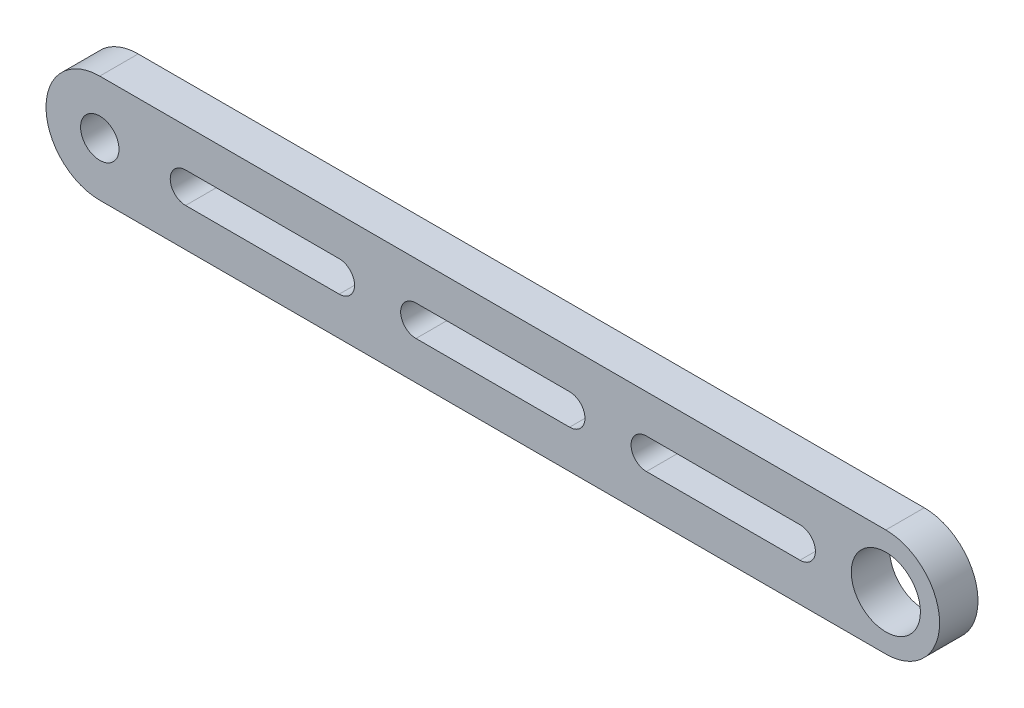
ISO-10303-21;
HEADER;
FILE_DESCRIPTION(('STEP AP214'),'2;1');
FILE_NAME('part.step','',(''),(''),'','','');
FILE_SCHEMA(('AUTOMOTIVE_DESIGN { 1 0 10303 214 1 1 1 1 }'));
ENDSEC;
DATA;
#1=APPLICATION_CONTEXT('core data for automotive mechanical design processes');
#2=APPLICATION_PROTOCOL_DEFINITION('international standard','automotive_design',2000,#1);
#3=PRODUCT_CONTEXT('',#1,'mechanical');
#4=PRODUCT('Part','Part','',(#3));
#5=PRODUCT_RELATED_PRODUCT_CATEGORY('part','',(#4));
#6=PRODUCT_DEFINITION_FORMATION('','',#4);
#7=PRODUCT_DEFINITION_CONTEXT('part definition',#1,'design');
#8=PRODUCT_DEFINITION('design','',#6,#7);
#9=PRODUCT_DEFINITION_SHAPE('','',#8);
#10=(LENGTH_UNIT() NAMED_UNIT(*) SI_UNIT(.MILLI.,.METRE.));
#11=(NAMED_UNIT(*) PLANE_ANGLE_UNIT() SI_UNIT($,.RADIAN.));
#12=(NAMED_UNIT(*) SI_UNIT($,.STERADIAN.) SOLID_ANGLE_UNIT());
#13=UNCERTAINTY_MEASURE_WITH_UNIT(LENGTH_MEASURE(1.E-05),#10,'distance_accuracy_value','');
#14=(GEOMETRIC_REPRESENTATION_CONTEXT(3) GLOBAL_UNCERTAINTY_ASSIGNED_CONTEXT((#13)) GLOBAL_UNIT_ASSIGNED_CONTEXT((#10,
#11,#12)) REPRESENTATION_CONTEXT('',''));
#15=CARTESIAN_POINT('',(0.,0.,0.));
#16=DIRECTION('',(0.,0.,1.));
#17=DIRECTION('',(1.,0.,0.));
#18=AXIS2_PLACEMENT_3D('',#15,#16,#17);
#19=CARTESIAN_POINT('',(-51.175,0.,2.5));
#20=DIRECTION('',(0.,0.,1.));
#21=DIRECTION('',(1.,0.,0.));
#22=AXIS2_PLACEMENT_3D('',#19,#20,#21);
#23=PLANE('',#22);
#24=CARTESIAN_POINT('',(-40.,0.,2.5));
#25=DIRECTION('',(0.,0.,1.));
#26=DIRECTION('',(1.,0.,0.));
#27=AXIS2_PLACEMENT_3D('',#24,#25,#26);
#28=CIRCLE('',#27,2.);
#29=CARTESIAN_POINT('',(-40.,2.,2.5));
#30=VERTEX_POINT('',#29);
#31=CARTESIAN_POINT('',(-40.,-2.00000000000001,2.5));
#32=VERTEX_POINT('',#31);
#33=EDGE_CURVE('E51',#30,#32,#28,.T.);
#34=ORIENTED_EDGE('',*,*,#33,.F.);
#35=DIRECTION('',(-1.,0.,0.));
#36=VECTOR('',#35,1.);
#37=CARTESIAN_POINT('',(-40.,2.,2.5));
#38=LINE('',#37,#36);
#39=CARTESIAN_POINT('',(-20.,2.,2.5));
#40=VERTEX_POINT('',#39);
#41=EDGE_CURVE('E173',#40,#30,#38,.T.);
#42=ORIENTED_EDGE('',*,*,#41,.F.);
#43=CARTESIAN_POINT('',(-20.,0.,2.5));
#44=DIRECTION('',(0.,0.,1.));
#45=DIRECTION('',(1.,0.,0.));
#46=AXIS2_PLACEMENT_3D('',#43,#44,#45);
#47=CIRCLE('',#46,2.);
#48=CARTESIAN_POINT('',(-20.,-2.00000000000001,2.5));
#49=VERTEX_POINT('',#48);
#50=EDGE_CURVE('E166',#49,#40,#47,.T.);
#51=ORIENTED_EDGE('',*,*,#50,.F.);
#52=DIRECTION('',(1.,0.,0.));
#53=VECTOR('',#52,1.);
#54=CARTESIAN_POINT('',(-40.,-2.00000000000001,2.5));
#55=LINE('',#54,#53);
#56=EDGE_CURVE('E153',#32,#49,#55,.T.);
#57=ORIENTED_EDGE('',*,*,#56,.F.);
#58=EDGE_LOOP('',(#34,#42,#51,#57));
#59=FACE_BOUND('',#58,.T.);
#60=CARTESIAN_POINT('',(20.,0.,2.5));
#61=DIRECTION('',(0.,0.,1.));
#62=DIRECTION('',(1.,0.,0.));
#63=AXIS2_PLACEMENT_3D('',#60,#61,#62);
#64=CIRCLE('',#63,2.);
#65=CARTESIAN_POINT('',(20.,2.,2.5));
#66=VERTEX_POINT('',#65);
#67=CARTESIAN_POINT('',(20.,-2.,2.5));
#68=VERTEX_POINT('',#67);
#69=EDGE_CURVE('E59',#66,#68,#64,.T.);
#70=ORIENTED_EDGE('',*,*,#69,.F.);
#71=DIRECTION('',(-1.,0.,0.));
#72=VECTOR('',#71,1.);
#73=CARTESIAN_POINT('',(20.,2.,2.5));
#74=LINE('',#73,#72);
#75=CARTESIAN_POINT('',(40.,2.00000000000001,2.5));
#76=VERTEX_POINT('',#75);
#77=EDGE_CURVE('E210',#76,#66,#74,.T.);
#78=ORIENTED_EDGE('',*,*,#77,.F.);
#79=CARTESIAN_POINT('',(40.,0.,2.5));
#80=DIRECTION('',(0.,0.,1.));
#81=DIRECTION('',(1.,0.,0.));
#82=AXIS2_PLACEMENT_3D('',#79,#80,#81);
#83=CIRCLE('',#82,2.);
#84=CARTESIAN_POINT('',(40.,-2.,2.5));
#85=VERTEX_POINT('',#84);
#86=EDGE_CURVE('E202',#85,#76,#83,.T.);
#87=ORIENTED_EDGE('',*,*,#86,.F.);
#88=DIRECTION('',(1.,0.,0.));
#89=VECTOR('',#88,1.);
#90=CARTESIAN_POINT('',(20.,-2.,2.5));
#91=LINE('',#90,#89);
#92=EDGE_CURVE('E191',#68,#85,#91,.T.);
#93=ORIENTED_EDGE('',*,*,#92,.F.);
#94=EDGE_LOOP('',(#70,#78,#87,#93));
#95=FACE_BOUND('',#94,.T.);
#96=CARTESIAN_POINT('',(-10.,0.,2.5));
#97=DIRECTION('',(0.,0.,1.));
#98=DIRECTION('',(1.,0.,0.));
#99=AXIS2_PLACEMENT_3D('',#96,#97,#98);
#100=CIRCLE('',#99,2.);
#101=CARTESIAN_POINT('',(-10.,2.,2.5));
#102=VERTEX_POINT('',#101);
#103=CARTESIAN_POINT('',(-9.99999999999999,-2.,2.5));
#104=VERTEX_POINT('',#103);
#105=EDGE_CURVE('E190',#102,#104,#100,.T.);
#106=ORIENTED_EDGE('',*,*,#105,.F.);
#107=DIRECTION('',(-1.,0.,0.));
#108=VECTOR('',#107,1.);
#109=CARTESIAN_POINT('',(-10.,2.,2.5));
#110=LINE('',#109,#108);
#111=CARTESIAN_POINT('',(10.,2.00000000000001,2.5));
#112=VERTEX_POINT('',#111);
#113=EDGE_CURVE('E227',#112,#102,#110,.T.);
#114=ORIENTED_EDGE('',*,*,#113,.F.);
#115=CARTESIAN_POINT('',(10.,0.,2.5));
#116=DIRECTION('',(0.,0.,1.));
#117=DIRECTION('',(1.,0.,0.));
#118=AXIS2_PLACEMENT_3D('',#115,#116,#117);
#119=CIRCLE('',#118,2.);
#120=CARTESIAN_POINT('',(10.,-2.,2.5));
#121=VERTEX_POINT('',#120);
#122=EDGE_CURVE('E224',#121,#112,#119,.T.);
#123=ORIENTED_EDGE('',*,*,#122,.F.);
#124=DIRECTION('',(1.,0.,0.));
#125=VECTOR('',#124,1.);
#126=CARTESIAN_POINT('',(-10.,-2.,2.5));
#127=LINE('',#126,#125);
#128=EDGE_CURVE('E221',#104,#121,#127,.T.);
#129=ORIENTED_EDGE('',*,*,#128,.F.);
#130=EDGE_LOOP('',(#106,#114,#123,#129));
#131=FACE_BOUND('',#130,.T.);
#132=CARTESIAN_POINT('',(51.175,0.,2.5));
#133=DIRECTION('',(0.,0.,1.));
#134=DIRECTION('',(1.,0.,0.));
#135=AXIS2_PLACEMENT_3D('',#132,#133,#134);
#136=CIRCLE('',#135,4.5);
#137=CARTESIAN_POINT('',(55.675,0.,2.5));
#138=VERTEX_POINT('',#137);
#139=EDGE_CURVE('E240',#138,#138,#136,.T.);
#140=ORIENTED_EDGE('',*,*,#139,.F.);
#141=EDGE_LOOP('',(#140));
#142=FACE_BOUND('',#141,.T.);
#143=CARTESIAN_POINT('',(-51.175,0.,2.5));
#144=DIRECTION('',(0.,0.,1.));
#145=DIRECTION('',(1.,0.,0.));
#146=AXIS2_PLACEMENT_3D('',#143,#144,#145);
#147=CIRCLE('',#146,7.00000000000002);
#148=CARTESIAN_POINT('',(-51.175,7.00000000000002,2.5));
#149=VERTEX_POINT('',#148);
#150=CARTESIAN_POINT('',(-51.175,-7.00000000000002,2.5));
#151=VERTEX_POINT('',#150);
#152=EDGE_CURVE('E246',#149,#151,#147,.T.);
#153=ORIENTED_EDGE('',*,*,#152,.T.);
#154=DIRECTION('',(1.,0.,0.));
#155=VECTOR('',#154,1.);
#156=CARTESIAN_POINT('',(-51.175,-7.00000000000002,2.5));
#157=LINE('',#156,#155);
#158=CARTESIAN_POINT('',(51.175,-7.00000000000002,2.5));
#159=VERTEX_POINT('',#158);
#160=EDGE_CURVE('E249',#151,#159,#157,.T.);
#161=ORIENTED_EDGE('',*,*,#160,.T.);
#162=CARTESIAN_POINT('',(51.175,0.,2.5));
#163=DIRECTION('',(0.,0.,1.));
#164=DIRECTION('',(1.,0.,0.));
#165=AXIS2_PLACEMENT_3D('',#162,#163,#164);
#166=CIRCLE('',#165,7.00000000000002);
#167=CARTESIAN_POINT('',(51.175,7.00000000000004,2.5));
#168=VERTEX_POINT('',#167);
#169=EDGE_CURVE('E252',#159,#168,#166,.T.);
#170=ORIENTED_EDGE('',*,*,#169,.T.);
#171=DIRECTION('',(-1.,0.,0.));
#172=VECTOR('',#171,1.);
#173=CARTESIAN_POINT('',(-51.175,7.00000000000002,2.5));
#174=LINE('',#173,#172);
#175=EDGE_CURVE('E254',#168,#149,#174,.T.);
#176=ORIENTED_EDGE('',*,*,#175,.T.);
#177=EDGE_LOOP('',(#153,#161,#170,#176));
#178=FACE_BOUND('',#177,.T.);
#179=CARTESIAN_POINT('',(-51.175,0.,2.5));
#180=DIRECTION('',(0.,0.,1.));
#181=DIRECTION('',(1.,0.,0.));
#182=AXIS2_PLACEMENT_3D('',#179,#180,#181);
#183=CIRCLE('',#182,2.5);
#184=CARTESIAN_POINT('',(-48.675,0.,2.5));
#185=VERTEX_POINT('',#184);
#186=EDGE_CURVE('E352',#185,#185,#183,.T.);
#187=ORIENTED_EDGE('',*,*,#186,.F.);
#188=EDGE_LOOP('',(#187));
#189=FACE_BOUND('',#188,.T.);
#190=ADVANCED_FACE('F36',(#59,#95,#131,#142,#178,#189),#23,.T.);
#191=CARTESIAN_POINT('',(-51.175,0.,-2.5));
#192=DIRECTION('',(0.,0.,1.));
#193=DIRECTION('',(1.,0.,0.));
#194=AXIS2_PLACEMENT_3D('',#191,#192,#193);
#195=PLANE('',#194);
#196=DIRECTION('',(-1.,0.,0.));
#197=VECTOR('',#196,1.);
#198=CARTESIAN_POINT('',(-81.175,1.99999999999999,-2.5));
#199=LINE('',#198,#197);
#200=CARTESIAN_POINT('',(-20.,2.,-2.5));
#201=VERTEX_POINT('',#200);
#202=CARTESIAN_POINT('',(-40.,2.,-2.5));
#203=VERTEX_POINT('',#202);
#204=EDGE_CURVE('E183',#201,#203,#199,.T.);
#205=ORIENTED_EDGE('',*,*,#204,.T.);
#206=CARTESIAN_POINT('',(-40.,0.,-2.5));
#207=DIRECTION('',(0.,0.,1.));
#208=DIRECTION('',(1.,0.,0.));
#209=AXIS2_PLACEMENT_3D('',#206,#207,#208);
#210=CIRCLE('',#209,2.);
#211=CARTESIAN_POINT('',(-40.,-2.00000000000001,-2.5));
#212=VERTEX_POINT('',#211);
#213=EDGE_CURVE('E187',#203,#212,#210,.T.);
#214=ORIENTED_EDGE('',*,*,#213,.T.);
#215=DIRECTION('',(1.,0.,0.));
#216=VECTOR('',#215,1.);
#217=CARTESIAN_POINT('',(-81.175,-2.00000000000002,-2.5));
#218=LINE('',#217,#216);
#219=CARTESIAN_POINT('',(-20.,-2.00000000000001,-2.5));
#220=VERTEX_POINT('',#219);
#221=EDGE_CURVE('E161',#212,#220,#218,.T.);
#222=ORIENTED_EDGE('',*,*,#221,.T.);
#223=CARTESIAN_POINT('',(-20.,0.,-2.5));
#224=DIRECTION('',(0.,0.,1.));
#225=DIRECTION('',(1.,0.,0.));
#226=AXIS2_PLACEMENT_3D('',#223,#224,#225);
#227=CIRCLE('',#226,2.);
#228=EDGE_CURVE('E169',#220,#201,#227,.T.);
#229=ORIENTED_EDGE('',*,*,#228,.T.);
#230=EDGE_LOOP('',(#205,#214,#222,#229));
#231=FACE_BOUND('',#230,.T.);
#232=DIRECTION('',(-1.,0.,0.));
#233=VECTOR('',#232,1.);
#234=CARTESIAN_POINT('',(-21.175,2.,-2.5));
#235=LINE('',#234,#233);
#236=CARTESIAN_POINT('',(40.,2.00000000000001,-2.5));
#237=VERTEX_POINT('',#236);
#238=CARTESIAN_POINT('',(20.,2.,-2.5));
#239=VERTEX_POINT('',#238);
#240=EDGE_CURVE('E214',#237,#239,#235,.T.);
#241=ORIENTED_EDGE('',*,*,#240,.T.);
#242=CARTESIAN_POINT('',(20.,0.,-2.5));
#243=DIRECTION('',(0.,0.,1.));
#244=DIRECTION('',(1.,0.,0.));
#245=AXIS2_PLACEMENT_3D('',#242,#243,#244);
#246=CIRCLE('',#245,2.);
#247=CARTESIAN_POINT('',(20.,-2.,-2.5));
#248=VERTEX_POINT('',#247);
#249=EDGE_CURVE('E162',#239,#248,#246,.T.);
#250=ORIENTED_EDGE('',*,*,#249,.T.);
#251=DIRECTION('',(1.,0.,0.));
#252=VECTOR('',#251,1.);
#253=CARTESIAN_POINT('',(-21.175,-2.00000000000001,-2.5));
#254=LINE('',#253,#252);
#255=CARTESIAN_POINT('',(40.,-2.,-2.5));
#256=VERTEX_POINT('',#255);
#257=EDGE_CURVE('E193',#248,#256,#254,.T.);
#258=ORIENTED_EDGE('',*,*,#257,.T.);
#259=CARTESIAN_POINT('',(40.,0.,-2.5));
#260=DIRECTION('',(0.,0.,1.));
#261=DIRECTION('',(1.,0.,0.));
#262=AXIS2_PLACEMENT_3D('',#259,#260,#261);
#263=CIRCLE('',#262,2.);
#264=EDGE_CURVE('E207',#256,#237,#263,.T.);
#265=ORIENTED_EDGE('',*,*,#264,.T.);
#266=EDGE_LOOP('',(#241,#250,#258,#265));
#267=FACE_BOUND('',#266,.T.);
#268=DIRECTION('',(-1.,0.,0.));
#269=VECTOR('',#268,1.);
#270=CARTESIAN_POINT('',(-51.175,2.,-2.5));
#271=LINE('',#270,#269);
#272=CARTESIAN_POINT('',(10.,2.00000000000001,-2.5));
#273=VERTEX_POINT('',#272);
#274=CARTESIAN_POINT('',(-10.,2.,-2.5));
#275=VERTEX_POINT('',#274);
#276=EDGE_CURVE('E44',#273,#275,#271,.T.);
#277=ORIENTED_EDGE('',*,*,#276,.T.);
#278=CARTESIAN_POINT('',(-10.,0.,-2.5));
#279=DIRECTION('',(0.,0.,1.));
#280=DIRECTION('',(1.,0.,0.));
#281=AXIS2_PLACEMENT_3D('',#278,#279,#280);
#282=CIRCLE('',#281,2.);
#283=CARTESIAN_POINT('',(-10.,-2.,-2.5));
#284=VERTEX_POINT('',#283);
#285=EDGE_CURVE('E11',#275,#284,#282,.T.);
#286=ORIENTED_EDGE('',*,*,#285,.T.);
#287=DIRECTION('',(1.,0.,0.));
#288=VECTOR('',#287,1.);
#289=CARTESIAN_POINT('',(-51.175,-2.00000000000001,-2.5));
#290=LINE('',#289,#288);
#291=CARTESIAN_POINT('',(9.99999999999999,-2.,-2.5));
#292=VERTEX_POINT('',#291);
#293=EDGE_CURVE('E275',#284,#292,#290,.T.);
#294=ORIENTED_EDGE('',*,*,#293,.T.);
#295=CARTESIAN_POINT('',(10.,0.,-2.5));
#296=DIRECTION('',(0.,0.,1.));
#297=DIRECTION('',(1.,0.,0.));
#298=AXIS2_PLACEMENT_3D('',#295,#296,#297);
#299=CIRCLE('',#298,2.);
#300=EDGE_CURVE('E278',#292,#273,#299,.T.);
#301=ORIENTED_EDGE('',*,*,#300,.T.);
#302=EDGE_LOOP('',(#277,#286,#294,#301));
#303=FACE_BOUND('',#302,.T.);
#304=CARTESIAN_POINT('',(-51.175,0.,-2.5));
#305=DIRECTION('',(0.,0.,1.));
#306=DIRECTION('',(1.,0.,0.));
#307=AXIS2_PLACEMENT_3D('',#304,#305,#306);
#308=CIRCLE('',#307,7.00000000000002);
#309=CARTESIAN_POINT('',(-51.175,7.00000000000002,-2.5));
#310=VERTEX_POINT('',#309);
#311=CARTESIAN_POINT('',(-51.175,-7.00000000000002,-2.5));
#312=VERTEX_POINT('',#311);
#313=EDGE_CURVE('E243',#310,#312,#308,.T.);
#314=ORIENTED_EDGE('',*,*,#313,.F.);
#315=DIRECTION('',(-1.,0.,0.));
#316=VECTOR('',#315,1.);
#317=CARTESIAN_POINT('',(-51.175,7.00000000000002,-2.5));
#318=LINE('',#317,#316);
#319=CARTESIAN_POINT('',(51.175,7.00000000000004,-2.5));
#320=VERTEX_POINT('',#319);
#321=EDGE_CURVE('E250',#320,#310,#318,.T.);
#322=ORIENTED_EDGE('',*,*,#321,.F.);
#323=CARTESIAN_POINT('',(51.175,0.,-2.5));
#324=DIRECTION('',(0.,0.,1.));
#325=DIRECTION('',(1.,0.,0.));
#326=AXIS2_PLACEMENT_3D('',#323,#324,#325);
#327=CIRCLE('',#326,7.00000000000002);
#328=CARTESIAN_POINT('',(51.175,-7.00000000000002,-2.5));
#329=VERTEX_POINT('',#328);
#330=EDGE_CURVE('E261',#329,#320,#327,.T.);
#331=ORIENTED_EDGE('',*,*,#330,.F.);
#332=DIRECTION('',(1.,0.,0.));
#333=VECTOR('',#332,1.);
#334=CARTESIAN_POINT('',(-51.175,-7.00000000000002,-2.5));
#335=LINE('',#334,#333);
#336=EDGE_CURVE('E259',#312,#329,#335,.T.);
#337=ORIENTED_EDGE('',*,*,#336,.F.);
#338=EDGE_LOOP('',(#314,#322,#331,#337));
#339=FACE_BOUND('',#338,.T.);
#340=CARTESIAN_POINT('',(51.175,0.,-2.5));
#341=DIRECTION('',(0.,0.,1.));
#342=DIRECTION('',(1.,0.,0.));
#343=AXIS2_PLACEMENT_3D('',#340,#341,#342);
#344=CIRCLE('',#343,4.5);
#345=CARTESIAN_POINT('',(55.675,0.,-2.5));
#346=VERTEX_POINT('',#345);
#347=EDGE_CURVE('E233',#346,#346,#344,.T.);
#348=ORIENTED_EDGE('',*,*,#347,.T.);
#349=EDGE_LOOP('',(#348));
#350=FACE_BOUND('',#349,.T.);
#351=CARTESIAN_POINT('',(-51.175,0.,-2.5));
#352=DIRECTION('',(0.,0.,1.));
#353=DIRECTION('',(1.,0.,0.));
#354=AXIS2_PLACEMENT_3D('',#351,#352,#353);
#355=CIRCLE('',#354,2.5);
#356=CARTESIAN_POINT('',(-48.675,0.,-2.5));
#357=VERTEX_POINT('',#356);
#358=EDGE_CURVE('E194',#357,#357,#355,.F.);
#359=ORIENTED_EDGE('',*,*,#358,.F.);
#360=EDGE_LOOP('',(#359));
#361=FACE_BOUND('',#360,.T.);
#362=ADVANCED_FACE('F282',(#231,#267,#303,#339,#350,#361),#195,.F.);
#363=CARTESIAN_POINT('',(-51.175,0.,2.5));
#364=DIRECTION('',(0.,0.,-1.));
#365=DIRECTION('',(-1.,0.,0.));
#366=AXIS2_PLACEMENT_3D('',#363,#364,#365);
#367=CYLINDRICAL_SURFACE('',#366,7.00000000000002);
#368=ORIENTED_EDGE('',*,*,#313,.T.);
#369=DIRECTION('',(0.,0.,-1.));
#370=VECTOR('',#369,1.);
#371=CARTESIAN_POINT('',(-51.175,-7.00000000000002,2.5));
#372=LINE('',#371,#370);
#373=EDGE_CURVE('E272',#151,#312,#372,.T.);
#374=ORIENTED_EDGE('',*,*,#373,.F.);
#375=ORIENTED_EDGE('',*,*,#152,.F.);
#376=DIRECTION('',(0.,0.,-1.));
#377=VECTOR('',#376,1.);
#378=CARTESIAN_POINT('',(-51.175,7.00000000000002,2.5));
#379=LINE('',#378,#377);
#380=EDGE_CURVE('E256',#149,#310,#379,.T.);
#381=ORIENTED_EDGE('',*,*,#380,.T.);
#382=EDGE_LOOP('',(#368,#374,#375,#381));
#383=FACE_BOUND('',#382,.T.);
#384=ADVANCED_FACE('F38',(#383),#367,.T.);
#385=CARTESIAN_POINT('',(-51.175,-7.00000000000002,2.5));
#386=DIRECTION('',(0.,1.,0.));
#387=DIRECTION('',(-1.,0.,0.));
#388=AXIS2_PLACEMENT_3D('',#385,#386,#387);
#389=PLANE('',#388);
#390=ORIENTED_EDGE('',*,*,#336,.T.);
#391=DIRECTION('',(0.,0.,-1.));
#392=VECTOR('',#391,1.);
#393=CARTESIAN_POINT('',(51.175,-7.00000000000002,2.5));
#394=LINE('',#393,#392);
#395=EDGE_CURVE('E269',#159,#329,#394,.T.);
#396=ORIENTED_EDGE('',*,*,#395,.F.);
#397=ORIENTED_EDGE('',*,*,#160,.F.);
#398=ORIENTED_EDGE('',*,*,#373,.T.);
#399=EDGE_LOOP('',(#390,#396,#397,#398));
#400=FACE_BOUND('',#399,.T.);
#401=ADVANCED_FACE('F329',(#400),#389,.F.);
#402=CARTESIAN_POINT('',(51.175,0.,2.5));
#403=DIRECTION('',(0.,0.,-1.));
#404=DIRECTION('',(-1.,0.,0.));
#405=AXIS2_PLACEMENT_3D('',#402,#403,#404);
#406=CYLINDRICAL_SURFACE('',#405,7.00000000000002);
#407=ORIENTED_EDGE('',*,*,#330,.T.);
#408=DIRECTION('',(0.,0.,-1.));
#409=VECTOR('',#408,1.);
#410=CARTESIAN_POINT('',(51.175,7.00000000000004,2.5));
#411=LINE('',#410,#409);
#412=EDGE_CURVE('E266',#168,#320,#411,.T.);
#413=ORIENTED_EDGE('',*,*,#412,.F.);
#414=ORIENTED_EDGE('',*,*,#169,.F.);
#415=ORIENTED_EDGE('',*,*,#395,.T.);
#416=EDGE_LOOP('',(#407,#413,#414,#415));
#417=FACE_BOUND('',#416,.T.);
#418=ADVANCED_FACE('F326',(#417),#406,.T.);
#419=CARTESIAN_POINT('',(-51.175,7.00000000000002,2.5));
#420=DIRECTION('',(0.,-1.,0.));
#421=DIRECTION('',(1.,0.,0.));
#422=AXIS2_PLACEMENT_3D('',#419,#420,#421);
#423=PLANE('',#422);
#424=ORIENTED_EDGE('',*,*,#321,.T.);
#425=ORIENTED_EDGE('',*,*,#380,.F.);
#426=ORIENTED_EDGE('',*,*,#175,.F.);
#427=ORIENTED_EDGE('',*,*,#412,.T.);
#428=EDGE_LOOP('',(#424,#425,#426,#427));
#429=FACE_BOUND('',#428,.T.);
#430=ADVANCED_FACE('F323',(#429),#423,.F.);
#431=CARTESIAN_POINT('',(51.175,0.,2.5));
#432=DIRECTION('',(0.,0.,-1.));
#433=DIRECTION('',(-1.,0.,0.));
#434=AXIS2_PLACEMENT_3D('',#431,#432,#433);
#435=CYLINDRICAL_SURFACE('',#434,4.5);
#436=ORIENTED_EDGE('',*,*,#139,.T.);
#437=EDGE_LOOP('',(#436));
#438=FACE_BOUND('',#437,.T.);
#439=ORIENTED_EDGE('',*,*,#347,.F.);
#440=EDGE_LOOP('',(#439));
#441=FACE_BOUND('',#440,.T.);
#442=ADVANCED_FACE('F321',(#438,#441),#435,.F.);
#443=CARTESIAN_POINT('',(-10.,0.,-7.5));
#444=DIRECTION('',(0.,0.,1.));
#445=DIRECTION('',(1.,0.,0.));
#446=AXIS2_PLACEMENT_3D('',#443,#444,#445);
#447=CYLINDRICAL_SURFACE('',#446,2.);
#448=DIRECTION('',(0.,0.,1.));
#449=VECTOR('',#448,1.);
#450=CARTESIAN_POINT('',(-10.,2.,-7.5));
#451=LINE('',#450,#449);
#452=EDGE_CURVE('E231',#275,#102,#451,.T.);
#453=ORIENTED_EDGE('',*,*,#452,.T.);
#454=ORIENTED_EDGE('',*,*,#105,.T.);
#455=DIRECTION('',(0.,0.,1.));
#456=VECTOR('',#455,1.);
#457=CARTESIAN_POINT('',(-10.,-2.,-7.5));
#458=LINE('',#457,#456);
#459=EDGE_CURVE('E230',#284,#104,#458,.T.);
#460=ORIENTED_EDGE('',*,*,#459,.F.);
#461=ORIENTED_EDGE('',*,*,#285,.F.);
#462=EDGE_LOOP('',(#453,#454,#460,#461));
#463=FACE_BOUND('',#462,.T.);
#464=ADVANCED_FACE('F299',(#463),#447,.F.);
#465=CARTESIAN_POINT('',(-10.,2.,-7.5));
#466=DIRECTION('',(0.,1.,0.));
#467=DIRECTION('',(-1.,0.,0.));
#468=AXIS2_PLACEMENT_3D('',#465,#466,#467);
#469=PLANE('',#468);
#470=DIRECTION('',(0.,0.,1.));
#471=VECTOR('',#470,1.);
#472=CARTESIAN_POINT('',(10.,2.00000000000001,-7.5));
#473=LINE('',#472,#471);
#474=EDGE_CURVE('E234',#273,#112,#473,.T.);
#475=ORIENTED_EDGE('',*,*,#474,.T.);
#476=ORIENTED_EDGE('',*,*,#113,.T.);
#477=ORIENTED_EDGE('',*,*,#452,.F.);
#478=ORIENTED_EDGE('',*,*,#276,.F.);
#479=EDGE_LOOP('',(#475,#476,#477,#478));
#480=FACE_BOUND('',#479,.T.);
#481=ADVANCED_FACE('F288',(#480),#469,.F.);
#482=CARTESIAN_POINT('',(10.,0.,-7.5));
#483=DIRECTION('',(0.,0.,1.));
#484=DIRECTION('',(1.,0.,0.));
#485=AXIS2_PLACEMENT_3D('',#482,#483,#484);
#486=CYLINDRICAL_SURFACE('',#485,2.);
#487=DIRECTION('',(0.,0.,1.));
#488=VECTOR('',#487,1.);
#489=CARTESIAN_POINT('',(10.,-2.,-7.5));
#490=LINE('',#489,#488);
#491=EDGE_CURVE('E236',#292,#121,#490,.T.);
#492=ORIENTED_EDGE('',*,*,#491,.T.);
#493=ORIENTED_EDGE('',*,*,#122,.T.);
#494=ORIENTED_EDGE('',*,*,#474,.F.);
#495=ORIENTED_EDGE('',*,*,#300,.F.);
#496=EDGE_LOOP('',(#492,#493,#494,#495));
#497=FACE_BOUND('',#496,.T.);
#498=ADVANCED_FACE('F290',(#497),#486,.F.);
#499=CARTESIAN_POINT('',(-10.,-2.,-7.5));
#500=DIRECTION('',(0.,-1.,0.));
#501=DIRECTION('',(1.,0.,0.));
#502=AXIS2_PLACEMENT_3D('',#499,#500,#501);
#503=PLANE('',#502);
#504=ORIENTED_EDGE('',*,*,#459,.T.);
#505=ORIENTED_EDGE('',*,*,#128,.T.);
#506=ORIENTED_EDGE('',*,*,#491,.F.);
#507=ORIENTED_EDGE('',*,*,#293,.F.);
#508=EDGE_LOOP('',(#504,#505,#506,#507));
#509=FACE_BOUND('',#508,.T.);
#510=ADVANCED_FACE('F301',(#509),#503,.F.);
#511=CARTESIAN_POINT('',(20.,0.,-7.5));
#512=DIRECTION('',(0.,0.,1.));
#513=DIRECTION('',(1.,0.,0.));
#514=AXIS2_PLACEMENT_3D('',#511,#512,#513);
#515=CYLINDRICAL_SURFACE('',#514,2.);
#516=DIRECTION('',(0.,0.,1.));
#517=VECTOR('',#516,1.);
#518=CARTESIAN_POINT('',(20.,2.,-7.5));
#519=LINE('',#518,#517);
#520=EDGE_CURVE('E212',#239,#66,#519,.T.);
#521=ORIENTED_EDGE('',*,*,#520,.T.);
#522=ORIENTED_EDGE('',*,*,#69,.T.);
#523=DIRECTION('',(0.,0.,1.));
#524=VECTOR('',#523,1.);
#525=CARTESIAN_POINT('',(20.,-2.,-7.5));
#526=LINE('',#525,#524);
#527=EDGE_CURVE('E197',#248,#68,#526,.T.);
#528=ORIENTED_EDGE('',*,*,#527,.F.);
#529=ORIENTED_EDGE('',*,*,#249,.F.);
#530=EDGE_LOOP('',(#521,#522,#528,#529));
#531=FACE_BOUND('',#530,.T.);
#532=ADVANCED_FACE('F303',(#531),#515,.F.);
#533=CARTESIAN_POINT('',(20.,2.,-7.5));
#534=DIRECTION('',(0.,1.,0.));
#535=DIRECTION('',(-1.,0.,0.));
#536=AXIS2_PLACEMENT_3D('',#533,#534,#535);
#537=PLANE('',#536);
#538=DIRECTION('',(0.,0.,1.));
#539=VECTOR('',#538,1.);
#540=CARTESIAN_POINT('',(40.,2.00000000000001,-7.5));
#541=LINE('',#540,#539);
#542=EDGE_CURVE('E204',#237,#76,#541,.T.);
#543=ORIENTED_EDGE('',*,*,#542,.T.);
#544=ORIENTED_EDGE('',*,*,#77,.T.);
#545=ORIENTED_EDGE('',*,*,#520,.F.);
#546=ORIENTED_EDGE('',*,*,#240,.F.);
#547=EDGE_LOOP('',(#543,#544,#545,#546));
#548=FACE_BOUND('',#547,.T.);
#549=ADVANCED_FACE('F309',(#548),#537,.F.);
#550=CARTESIAN_POINT('',(40.,0.,-7.5));
#551=DIRECTION('',(0.,0.,1.));
#552=DIRECTION('',(1.,0.,0.));
#553=AXIS2_PLACEMENT_3D('',#550,#551,#552);
#554=CYLINDRICAL_SURFACE('',#553,2.);
#555=DIRECTION('',(0.,0.,1.));
#556=VECTOR('',#555,1.);
#557=CARTESIAN_POINT('',(40.,-2.,-7.5));
#558=LINE('',#557,#556);
#559=EDGE_CURVE('E199',#256,#85,#558,.T.);
#560=ORIENTED_EDGE('',*,*,#559,.T.);
#561=ORIENTED_EDGE('',*,*,#86,.T.);
#562=ORIENTED_EDGE('',*,*,#542,.F.);
#563=ORIENTED_EDGE('',*,*,#264,.F.);
#564=EDGE_LOOP('',(#560,#561,#562,#563));
#565=FACE_BOUND('',#564,.T.);
#566=ADVANCED_FACE('F377',(#565),#554,.F.);
#567=CARTESIAN_POINT('',(20.,-2.,-7.5));
#568=DIRECTION('',(0.,-1.,0.));
#569=DIRECTION('',(1.,0.,0.));
#570=AXIS2_PLACEMENT_3D('',#567,#568,#569);
#571=PLANE('',#570);
#572=ORIENTED_EDGE('',*,*,#527,.T.);
#573=ORIENTED_EDGE('',*,*,#92,.T.);
#574=ORIENTED_EDGE('',*,*,#559,.F.);
#575=ORIENTED_EDGE('',*,*,#257,.F.);
#576=EDGE_LOOP('',(#572,#573,#574,#575));
#577=FACE_BOUND('',#576,.T.);
#578=ADVANCED_FACE('F371',(#577),#571,.F.);
#579=CARTESIAN_POINT('',(-40.,0.,-7.5));
#580=DIRECTION('',(0.,0.,1.));
#581=DIRECTION('',(1.,0.,0.));
#582=AXIS2_PLACEMENT_3D('',#579,#580,#581);
#583=CYLINDRICAL_SURFACE('',#582,2.);
#584=DIRECTION('',(0.,0.,1.));
#585=VECTOR('',#584,1.);
#586=CARTESIAN_POINT('',(-40.,2.,-7.5));
#587=LINE('',#586,#585);
#588=EDGE_CURVE('E181',#203,#30,#587,.T.);
#589=ORIENTED_EDGE('',*,*,#588,.T.);
#590=ORIENTED_EDGE('',*,*,#33,.T.);
#591=DIRECTION('',(0.,0.,1.));
#592=VECTOR('',#591,1.);
#593=CARTESIAN_POINT('',(-40.,-2.00000000000001,-7.5));
#594=LINE('',#593,#592);
#595=EDGE_CURVE('E158',#212,#32,#594,.T.);
#596=ORIENTED_EDGE('',*,*,#595,.F.);
#597=ORIENTED_EDGE('',*,*,#213,.F.);
#598=EDGE_LOOP('',(#589,#590,#596,#597));
#599=FACE_BOUND('',#598,.T.);
#600=ADVANCED_FACE('F360',(#599),#583,.F.);
#601=CARTESIAN_POINT('',(-40.,2.,-7.5));
#602=DIRECTION('',(0.,1.,0.));
#603=DIRECTION('',(-1.,0.,0.));
#604=AXIS2_PLACEMENT_3D('',#601,#602,#603);
#605=PLANE('',#604);
#606=DIRECTION('',(0.,0.,1.));
#607=VECTOR('',#606,1.);
#608=CARTESIAN_POINT('',(-20.,2.,-7.5));
#609=LINE('',#608,#607);
#610=EDGE_CURVE('E174',#201,#40,#609,.T.);
#611=ORIENTED_EDGE('',*,*,#610,.T.);
#612=ORIENTED_EDGE('',*,*,#41,.T.);
#613=ORIENTED_EDGE('',*,*,#588,.F.);
#614=ORIENTED_EDGE('',*,*,#204,.F.);
#615=EDGE_LOOP('',(#611,#612,#613,#614));
#616=FACE_BOUND('',#615,.T.);
#617=ADVANCED_FACE('F363',(#616),#605,.F.);
#618=CARTESIAN_POINT('',(-20.,0.,-7.5));
#619=DIRECTION('',(0.,0.,1.));
#620=DIRECTION('',(1.,0.,0.));
#621=AXIS2_PLACEMENT_3D('',#618,#619,#620);
#622=CYLINDRICAL_SURFACE('',#621,2.);
#623=DIRECTION('',(0.,0.,1.));
#624=VECTOR('',#623,1.);
#625=CARTESIAN_POINT('',(-20.,-2.00000000000001,-7.5));
#626=LINE('',#625,#624);
#627=EDGE_CURVE('E156',#220,#49,#626,.T.);
#628=ORIENTED_EDGE('',*,*,#627,.T.);
#629=ORIENTED_EDGE('',*,*,#50,.T.);
#630=ORIENTED_EDGE('',*,*,#610,.F.);
#631=ORIENTED_EDGE('',*,*,#228,.F.);
#632=EDGE_LOOP('',(#628,#629,#630,#631));
#633=FACE_BOUND('',#632,.T.);
#634=ADVANCED_FACE('F165',(#633),#622,.F.);
#635=CARTESIAN_POINT('',(-40.,-2.00000000000001,-7.5));
#636=DIRECTION('',(0.,-1.,0.));
#637=DIRECTION('',(1.,0.,0.));
#638=AXIS2_PLACEMENT_3D('',#635,#636,#637);
#639=PLANE('',#638);
#640=ORIENTED_EDGE('',*,*,#595,.T.);
#641=ORIENTED_EDGE('',*,*,#56,.T.);
#642=ORIENTED_EDGE('',*,*,#627,.F.);
#643=ORIENTED_EDGE('',*,*,#221,.F.);
#644=EDGE_LOOP('',(#640,#641,#642,#643));
#645=FACE_BOUND('',#644,.T.);
#646=ADVANCED_FACE('F155',(#645),#639,.F.);
#647=CARTESIAN_POINT('',(-51.175,0.,-15.2279220613578));
#648=DIRECTION('',(0.,0.,1.));
#649=DIRECTION('',(1.,0.,0.));
#650=AXIS2_PLACEMENT_3D('',#647,#648,#649);
#651=CYLINDRICAL_SURFACE('',#650,2.5);
#652=ORIENTED_EDGE('',*,*,#358,.T.);
#653=EDGE_LOOP('',(#652));
#654=FACE_BOUND('',#653,.T.);
#655=ORIENTED_EDGE('',*,*,#186,.T.);
#656=EDGE_LOOP('',(#655));
#657=FACE_BOUND('',#656,.T.);
#658=ADVANCED_FACE('F401',(#654,#657),#651,.F.);
#659=CLOSED_SHELL('',(#190,#362,#384,#401,#418,#430,#442,#464,#481,#498,#510,#532,#549,#566,
#578,#600,#617,#634,#646,#658));
#660=MANIFOLD_SOLID_BREP('B2',#659);
#661=ADVANCED_BREP_SHAPE_REPRESENTATION('',(#18,#660),#14);
#662=SHAPE_DEFINITION_REPRESENTATION(#9,#661);
ENDSEC;
END-ISO-10303-21;
